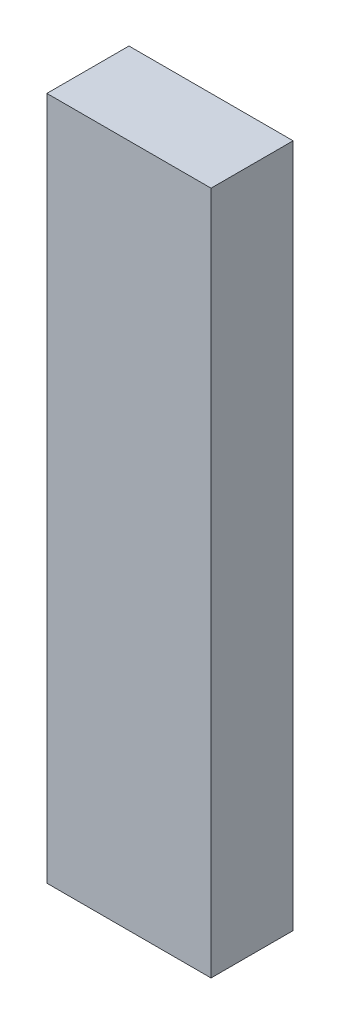
ISO-10303-21;
HEADER;
FILE_DESCRIPTION(('STEP AP214'),'2;1');
FILE_NAME('part.step','',(''),(''),'','','');
FILE_SCHEMA(('AUTOMOTIVE_DESIGN { 1 0 10303 214 1 1 1 1 }'));
ENDSEC;
DATA;
#1=APPLICATION_CONTEXT('core data for automotive mechanical design processes');
#2=APPLICATION_PROTOCOL_DEFINITION('international standard','automotive_design',2000,#1);
#3=PRODUCT_CONTEXT('',#1,'mechanical');
#4=PRODUCT('Part','Part','',(#3));
#5=PRODUCT_RELATED_PRODUCT_CATEGORY('part','',(#4));
#6=PRODUCT_DEFINITION_FORMATION('','',#4);
#7=PRODUCT_DEFINITION_CONTEXT('part definition',#1,'design');
#8=PRODUCT_DEFINITION('design','',#6,#7);
#9=PRODUCT_DEFINITION_SHAPE('','',#8);
#10=(LENGTH_UNIT() NAMED_UNIT(*) SI_UNIT(.MILLI.,.METRE.));
#11=(NAMED_UNIT(*) PLANE_ANGLE_UNIT() SI_UNIT($,.RADIAN.));
#12=(NAMED_UNIT(*) SI_UNIT($,.STERADIAN.) SOLID_ANGLE_UNIT());
#13=UNCERTAINTY_MEASURE_WITH_UNIT(LENGTH_MEASURE(1.E-05),#10,'distance_accuracy_value','');
#14=(GEOMETRIC_REPRESENTATION_CONTEXT(3) GLOBAL_UNCERTAINTY_ASSIGNED_CONTEXT((#13)) GLOBAL_UNIT_ASSIGNED_CONTEXT((#10,
#11,#12)) REPRESENTATION_CONTEXT('',''));
#15=CARTESIAN_POINT('',(0.,0.,0.));
#16=DIRECTION('',(0.,0.,1.));
#17=DIRECTION('',(1.,0.,0.));
#18=AXIS2_PLACEMENT_3D('',#15,#16,#17);
#19=CARTESIAN_POINT('',(-3.,25.,1.5));
#20=DIRECTION('',(1.,0.,0.));
#21=DIRECTION('',(0.,0.,-1.));
#22=AXIS2_PLACEMENT_3D('',#19,#20,#21);
#23=PLANE('',#22);
#24=DIRECTION('',(0.,0.,1.));
#25=VECTOR('',#24,1.);
#26=CARTESIAN_POINT('',(-3.,0.,1.5));
#27=LINE('',#26,#25);
#28=CARTESIAN_POINT('',(-3.,0.,-1.5));
#29=VERTEX_POINT('',#28);
#30=CARTESIAN_POINT('',(-3.,0.,1.5));
#31=VERTEX_POINT('',#30);
#32=EDGE_CURVE('E105',#29,#31,#27,.T.);
#33=ORIENTED_EDGE('',*,*,#32,.T.);
#34=DIRECTION('',(0.,-1.,0.));
#35=VECTOR('',#34,1.);
#36=CARTESIAN_POINT('',(-3.,25.,1.5));
#37=LINE('',#36,#35);
#38=CARTESIAN_POINT('',(-3.,25.,1.5));
#39=VERTEX_POINT('',#38);
#40=EDGE_CURVE('E11',#39,#31,#37,.T.);
#41=ORIENTED_EDGE('',*,*,#40,.F.);
#42=DIRECTION('',(0.,0.,1.));
#43=VECTOR('',#42,1.);
#44=CARTESIAN_POINT('',(-3.,25.,1.5));
#45=LINE('',#44,#43);
#46=CARTESIAN_POINT('',(-3.,25.,-1.5));
#47=VERTEX_POINT('',#46);
#48=EDGE_CURVE('E89',#47,#39,#45,.T.);
#49=ORIENTED_EDGE('',*,*,#48,.F.);
#50=DIRECTION('',(0.,-1.,0.));
#51=VECTOR('',#50,1.);
#52=CARTESIAN_POINT('',(-3.,25.,-1.5));
#53=LINE('',#52,#51);
#54=EDGE_CURVE('E98',#47,#29,#53,.T.);
#55=ORIENTED_EDGE('',*,*,#54,.T.);
#56=EDGE_LOOP('',(#33,#41,#49,#55));
#57=FACE_BOUND('',#56,.T.);
#58=ADVANCED_FACE('F39',(#57),#23,.F.);
#59=CARTESIAN_POINT('',(3.,25.,1.5));
#60=DIRECTION('',(0.,0.,-1.));
#61=DIRECTION('',(-1.,0.,0.));
#62=AXIS2_PLACEMENT_3D('',#59,#60,#61);
#63=PLANE('',#62);
#64=DIRECTION('',(1.,0.,0.));
#65=VECTOR('',#64,1.);
#66=CARTESIAN_POINT('',(3.,0.,1.5));
#67=LINE('',#66,#65);
#68=CARTESIAN_POINT('',(3.,0.,1.5));
#69=VERTEX_POINT('',#68);
#70=EDGE_CURVE('E94',#31,#69,#67,.T.);
#71=ORIENTED_EDGE('',*,*,#70,.T.);
#72=DIRECTION('',(0.,-1.,0.));
#73=VECTOR('',#72,1.);
#74=CARTESIAN_POINT('',(3.,25.,1.5));
#75=LINE('',#74,#73);
#76=CARTESIAN_POINT('',(3.,25.,1.5));
#77=VERTEX_POINT('',#76);
#78=EDGE_CURVE('E50',#77,#69,#75,.T.);
#79=ORIENTED_EDGE('',*,*,#78,.F.);
#80=DIRECTION('',(1.,0.,0.));
#81=VECTOR('',#80,1.);
#82=CARTESIAN_POINT('',(3.,25.,1.5));
#83=LINE('',#82,#81);
#84=EDGE_CURVE('E84',#39,#77,#83,.T.);
#85=ORIENTED_EDGE('',*,*,#84,.F.);
#86=ORIENTED_EDGE('',*,*,#40,.T.);
#87=EDGE_LOOP('',(#71,#79,#85,#86));
#88=FACE_BOUND('',#87,.T.);
#89=ADVANCED_FACE('F91',(#88),#63,.F.);
#90=CARTESIAN_POINT('',(3.,25.,1.5));
#91=DIRECTION('',(-1.,0.,0.));
#92=DIRECTION('',(0.,0.,1.));
#93=AXIS2_PLACEMENT_3D('',#90,#91,#92);
#94=PLANE('',#93);
#95=DIRECTION('',(0.,0.,-1.));
#96=VECTOR('',#95,1.);
#97=CARTESIAN_POINT('',(3.,0.,1.5));
#98=LINE('',#97,#96);
#99=CARTESIAN_POINT('',(3.,0.,-1.5));
#100=VERTEX_POINT('',#99);
#101=EDGE_CURVE('E75',#69,#100,#98,.T.);
#102=ORIENTED_EDGE('',*,*,#101,.T.);
#103=DIRECTION('',(0.,-1.,0.));
#104=VECTOR('',#103,1.);
#105=CARTESIAN_POINT('',(3.,25.,-1.5));
#106=LINE('',#105,#104);
#107=CARTESIAN_POINT('',(3.,25.,-1.5));
#108=VERTEX_POINT('',#107);
#109=EDGE_CURVE('E92',#108,#100,#106,.T.);
#110=ORIENTED_EDGE('',*,*,#109,.F.);
#111=DIRECTION('',(0.,0.,-1.));
#112=VECTOR('',#111,1.);
#113=CARTESIAN_POINT('',(3.,25.,1.5));
#114=LINE('',#113,#112);
#115=EDGE_CURVE('E86',#77,#108,#114,.T.);
#116=ORIENTED_EDGE('',*,*,#115,.F.);
#117=ORIENTED_EDGE('',*,*,#78,.T.);
#118=EDGE_LOOP('',(#102,#110,#116,#117));
#119=FACE_BOUND('',#118,.T.);
#120=ADVANCED_FACE('F96',(#119),#94,.F.);
#121=CARTESIAN_POINT('',(3.,25.,-1.5));
#122=DIRECTION('',(0.,0.,1.));
#123=DIRECTION('',(1.,0.,0.));
#124=AXIS2_PLACEMENT_3D('',#121,#122,#123);
#125=PLANE('',#124);
#126=DIRECTION('',(-1.,0.,0.));
#127=VECTOR('',#126,1.);
#128=CARTESIAN_POINT('',(3.,0.,-1.5));
#129=LINE('',#128,#127);
#130=EDGE_CURVE('E79',#100,#29,#129,.T.);
#131=ORIENTED_EDGE('',*,*,#130,.T.);
#132=ORIENTED_EDGE('',*,*,#54,.F.);
#133=DIRECTION('',(-1.,0.,0.));
#134=VECTOR('',#133,1.);
#135=CARTESIAN_POINT('',(3.,25.,-1.5));
#136=LINE('',#135,#134);
#137=EDGE_CURVE('E54',#108,#47,#136,.T.);
#138=ORIENTED_EDGE('',*,*,#137,.F.);
#139=ORIENTED_EDGE('',*,*,#109,.T.);
#140=EDGE_LOOP('',(#131,#132,#138,#139));
#141=FACE_BOUND('',#140,.T.);
#142=ADVANCED_FACE('F108',(#141),#125,.F.);
#143=CARTESIAN_POINT('',(0.,25.,0.));
#144=DIRECTION('',(0.,1.,0.));
#145=DIRECTION('',(0.,0.,1.));
#146=AXIS2_PLACEMENT_3D('',#143,#144,#145);
#147=PLANE('',#146);
#148=ORIENTED_EDGE('',*,*,#48,.T.);
#149=ORIENTED_EDGE('',*,*,#84,.T.);
#150=ORIENTED_EDGE('',*,*,#115,.T.);
#151=ORIENTED_EDGE('',*,*,#137,.T.);
#152=EDGE_LOOP('',(#148,#149,#150,#151));
#153=FACE_BOUND('',#152,.T.);
#154=ADVANCED_FACE('F88',(#153),#147,.T.);
#155=CARTESIAN_POINT('',(0.,0.,0.));
#156=DIRECTION('',(0.,1.,0.));
#157=DIRECTION('',(0.,0.,1.));
#158=AXIS2_PLACEMENT_3D('',#155,#156,#157);
#159=PLANE('',#158);
#160=ORIENTED_EDGE('',*,*,#32,.F.);
#161=ORIENTED_EDGE('',*,*,#130,.F.);
#162=ORIENTED_EDGE('',*,*,#101,.F.);
#163=ORIENTED_EDGE('',*,*,#70,.F.);
#164=EDGE_LOOP('',(#160,#161,#162,#163));
#165=FACE_BOUND('',#164,.T.);
#166=ADVANCED_FACE('F115',(#165),#159,.F.);
#167=CLOSED_SHELL('',(#58,#89,#120,#142,#154,#166));
#168=MANIFOLD_SOLID_BREP('B2',#167);
#169=ADVANCED_BREP_SHAPE_REPRESENTATION('',(#18,#168),#14);
#170=SHAPE_DEFINITION_REPRESENTATION(#9,#169);
ENDSEC;
END-ISO-10303-21;
